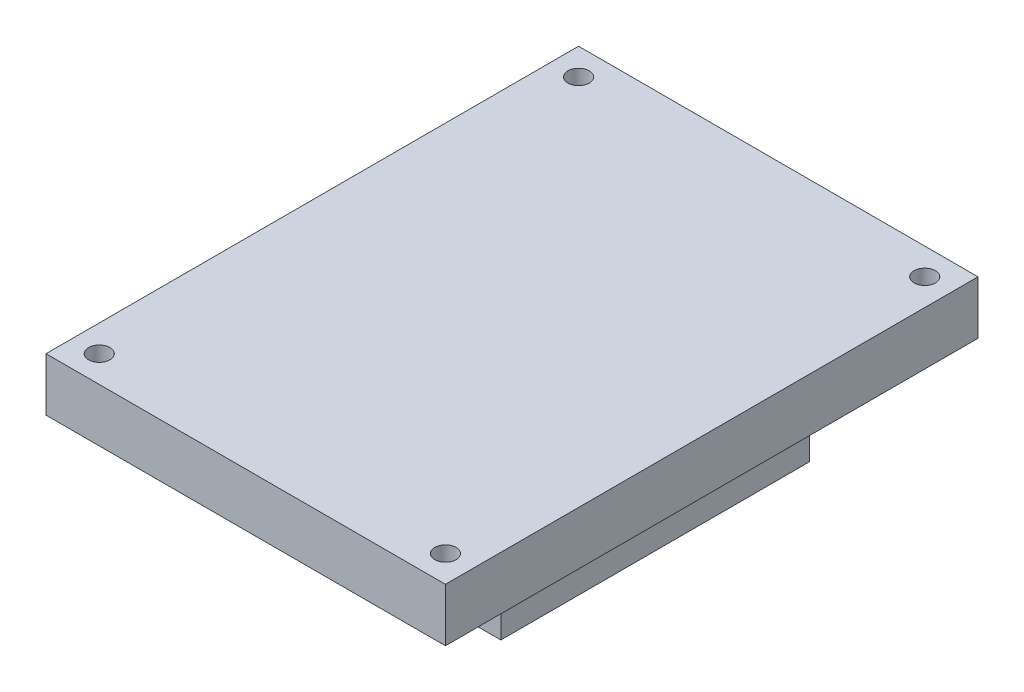
ISO-10303-21;
HEADER;
FILE_DESCRIPTION(('STEP AP214'),'2;1');
FILE_NAME('part.step','',(''),(''),'','','');
FILE_SCHEMA(('AUTOMOTIVE_DESIGN { 1 0 10303 214 1 1 1 1 }'));
ENDSEC;
DATA;
#1=APPLICATION_CONTEXT('core data for automotive mechanical design processes');
#2=APPLICATION_PROTOCOL_DEFINITION('international standard','automotive_design',2000,#1);
#3=PRODUCT_CONTEXT('',#1,'mechanical');
#4=PRODUCT('Part','Part','',(#3));
#5=PRODUCT_RELATED_PRODUCT_CATEGORY('part','',(#4));
#6=PRODUCT_DEFINITION_FORMATION('','',#4);
#7=PRODUCT_DEFINITION_CONTEXT('part definition',#1,'design');
#8=PRODUCT_DEFINITION('design','',#6,#7);
#9=PRODUCT_DEFINITION_SHAPE('','',#8);
#10=(LENGTH_UNIT() NAMED_UNIT(*) SI_UNIT(.MILLI.,.METRE.));
#11=(NAMED_UNIT(*) PLANE_ANGLE_UNIT() SI_UNIT($,.RADIAN.));
#12=(NAMED_UNIT(*) SI_UNIT($,.STERADIAN.) SOLID_ANGLE_UNIT());
#13=UNCERTAINTY_MEASURE_WITH_UNIT(LENGTH_MEASURE(1.E-05),#10,'distance_accuracy_value','');
#14=(GEOMETRIC_REPRESENTATION_CONTEXT(3) GLOBAL_UNCERTAINTY_ASSIGNED_CONTEXT((#13)) GLOBAL_UNIT_ASSIGNED_CONTEXT((#10,
#11,#12)) REPRESENTATION_CONTEXT('',''));
#15=CARTESIAN_POINT('',(0.,0.,0.));
#16=DIRECTION('',(0.,0.,1.));
#17=DIRECTION('',(1.,0.,0.));
#18=AXIS2_PLACEMENT_3D('',#15,#16,#17);
#19=CARTESIAN_POINT('',(0.,0.,0.));
#20=DIRECTION('',(0.,1.,0.));
#21=DIRECTION('',(0.,0.,1.));
#22=AXIS2_PLACEMENT_3D('',#19,#20,#21);
#23=PLANE('',#22);
#24=CARTESIAN_POINT('',(-32.5,0.,45.));
#25=DIRECTION('',(0.,-1.,0.));
#26=DIRECTION('',(0.,0.,1.));
#27=AXIS2_PLACEMENT_3D('',#24,#25,#26);
#28=CIRCLE('',#27,2.);
#29=CARTESIAN_POINT('',(-32.5,0.,47.));
#30=VERTEX_POINT('',#29);
#31=EDGE_CURVE('E556',#30,#30,#28,.T.);
#32=ORIENTED_EDGE('',*,*,#31,.F.);
#33=EDGE_LOOP('',(#32));
#34=FACE_BOUND('',#33,.T.);
#35=CARTESIAN_POINT('',(32.5,0.,45.));
#36=DIRECTION('',(0.,-1.,0.));
#37=DIRECTION('',(0.,0.,-1.));
#38=AXIS2_PLACEMENT_3D('',#35,#36,#37);
#39=CIRCLE('',#38,2.);
#40=CARTESIAN_POINT('',(32.5,0.,43.));
#41=VERTEX_POINT('',#40);
#42=EDGE_CURVE('E557',#41,#41,#39,.T.);
#43=ORIENTED_EDGE('',*,*,#42,.F.);
#44=EDGE_LOOP('',(#43));
#45=FACE_BOUND('',#44,.T.);
#46=CARTESIAN_POINT('',(32.5,0.,-45.));
#47=DIRECTION('',(0.,-1.,0.));
#48=DIRECTION('',(0.,0.,1.));
#49=AXIS2_PLACEMENT_3D('',#46,#47,#48);
#50=CIRCLE('',#49,2.);
#51=CARTESIAN_POINT('',(32.5,0.,-43.));
#52=VERTEX_POINT('',#51);
#53=EDGE_CURVE('E559',#52,#52,#50,.T.);
#54=ORIENTED_EDGE('',*,*,#53,.F.);
#55=EDGE_LOOP('',(#54));
#56=FACE_BOUND('',#55,.T.);
#57=CARTESIAN_POINT('',(-32.5,0.,-45.));
#58=DIRECTION('',(0.,-1.,0.));
#59=DIRECTION('',(0.,0.,-1.));
#60=AXIS2_PLACEMENT_3D('',#57,#58,#59);
#61=CIRCLE('',#60,2.);
#62=CARTESIAN_POINT('',(-32.5,0.,-47.));
#63=VERTEX_POINT('',#62);
#64=EDGE_CURVE('E230',#63,#63,#61,.T.);
#65=ORIENTED_EDGE('',*,*,#64,.F.);
#66=EDGE_LOOP('',(#65));
#67=FACE_BOUND('',#66,.T.);
#68=DIRECTION('',(0.,0.,1.));
#69=VECTOR('',#68,1.);
#70=CARTESIAN_POINT('',(-37.5,0.,50.));
#71=LINE('',#70,#69);
#72=CARTESIAN_POINT('',(-37.5,0.,-50.));
#73=VERTEX_POINT('',#72);
#74=CARTESIAN_POINT('',(-37.5,0.,50.));
#75=VERTEX_POINT('',#74);
#76=EDGE_CURVE('E200',#73,#75,#71,.T.);
#77=ORIENTED_EDGE('',*,*,#76,.F.);
#78=DIRECTION('',(-1.,0.,0.));
#79=VECTOR('',#78,1.);
#80=CARTESIAN_POINT('',(37.5,0.,-50.));
#81=LINE('',#80,#79);
#82=CARTESIAN_POINT('',(37.5,0.,-50.));
#83=VERTEX_POINT('',#82);
#84=EDGE_CURVE('E205',#83,#73,#81,.T.);
#85=ORIENTED_EDGE('',*,*,#84,.F.);
#86=DIRECTION('',(0.,0.,-1.));
#87=VECTOR('',#86,1.);
#88=CARTESIAN_POINT('',(37.5,0.,50.));
#89=LINE('',#88,#87);
#90=CARTESIAN_POINT('',(37.5,0.,50.));
#91=VERTEX_POINT('',#90);
#92=EDGE_CURVE('E216',#91,#83,#89,.T.);
#93=ORIENTED_EDGE('',*,*,#92,.F.);
#94=DIRECTION('',(1.,0.,0.));
#95=VECTOR('',#94,1.);
#96=CARTESIAN_POINT('',(37.5,0.,50.));
#97=LINE('',#96,#95);
#98=EDGE_CURVE('E214',#75,#91,#97,.T.);
#99=ORIENTED_EDGE('',*,*,#98,.F.);
#100=EDGE_LOOP('',(#77,#85,#93,#99));
#101=FACE_BOUND('',#100,.T.);
#102=DIRECTION('',(0.,0.,-1.));
#103=VECTOR('',#102,1.);
#104=CARTESIAN_POINT('',(-15.,0.,17.099834820955));
#105=LINE('',#104,#103);
#106=CARTESIAN_POINT('',(-15.,0.,17.099834820955));
#107=VERTEX_POINT('',#106);
#108=CARTESIAN_POINT('',(-15.,0.,-40.900165179045));
#109=VERTEX_POINT('',#108);
#110=EDGE_CURVE('E147',#107,#109,#105,.T.);
#111=ORIENTED_EDGE('',*,*,#110,.F.);
#112=DIRECTION('',(-1.,0.,0.));
#113=VECTOR('',#112,1.);
#114=CARTESIAN_POINT('',(-15.,0.,17.099834820955));
#115=LINE('',#114,#113);
#116=CARTESIAN_POINT('',(15.,0.,17.099834820955));
#117=VERTEX_POINT('',#116);
#118=EDGE_CURVE('E177',#117,#107,#115,.T.);
#119=ORIENTED_EDGE('',*,*,#118,.F.);
#120=DIRECTION('',(0.,0.,1.));
#121=VECTOR('',#120,1.);
#122=CARTESIAN_POINT('',(15.,0.,17.099834820955));
#123=LINE('',#122,#121);
#124=CARTESIAN_POINT('',(15.,0.,-40.900165179045));
#125=VERTEX_POINT('',#124);
#126=EDGE_CURVE('E61',#125,#117,#123,.T.);
#127=ORIENTED_EDGE('',*,*,#126,.F.);
#128=DIRECTION('',(1.,0.,0.));
#129=VECTOR('',#128,1.);
#130=CARTESIAN_POINT('',(-15.,0.,-40.900165179045));
#131=LINE('',#130,#129);
#132=EDGE_CURVE('E56',#109,#125,#131,.T.);
#133=ORIENTED_EDGE('',*,*,#132,.F.);
#134=EDGE_LOOP('',(#111,#119,#127,#133));
#135=FACE_BOUND('',#134,.T.);
#136=ADVANCED_FACE('F39',(#34,#45,#56,#67,#101,#135),#23,.F.);
#137=CARTESIAN_POINT('',(-37.5,10.,50.));
#138=DIRECTION('',(1.,0.,0.));
#139=DIRECTION('',(0.,0.,-1.));
#140=AXIS2_PLACEMENT_3D('',#137,#138,#139);
#141=PLANE('',#140);
#142=ORIENTED_EDGE('',*,*,#76,.T.);
#143=DIRECTION('',(0.,-1.,0.));
#144=VECTOR('',#143,1.);
#145=CARTESIAN_POINT('',(-37.5,10.,50.));
#146=LINE('',#145,#144);
#147=CARTESIAN_POINT('',(-37.5,10.,50.));
#148=VERTEX_POINT('',#147);
#149=EDGE_CURVE('E11',#148,#75,#146,.T.);
#150=ORIENTED_EDGE('',*,*,#149,.F.);
#151=DIRECTION('',(0.,0.,1.));
#152=VECTOR('',#151,1.);
#153=CARTESIAN_POINT('',(-37.5,10.,50.));
#154=LINE('',#153,#152);
#155=CARTESIAN_POINT('',(-37.5,10.,-50.));
#156=VERTEX_POINT('',#155);
#157=EDGE_CURVE('E201',#156,#148,#154,.T.);
#158=ORIENTED_EDGE('',*,*,#157,.F.);
#159=DIRECTION('',(0.,-1.,0.));
#160=VECTOR('',#159,1.);
#161=CARTESIAN_POINT('',(-37.5,10.,-50.));
#162=LINE('',#161,#160);
#163=EDGE_CURVE('E211',#156,#73,#162,.T.);
#164=ORIENTED_EDGE('',*,*,#163,.T.);
#165=EDGE_LOOP('',(#142,#150,#158,#164));
#166=FACE_BOUND('',#165,.T.);
#167=ADVANCED_FACE('F41',(#166),#141,.F.);
#168=CARTESIAN_POINT('',(37.5,10.,50.));
#169=DIRECTION('',(0.,0.,-1.));
#170=DIRECTION('',(-1.,0.,0.));
#171=AXIS2_PLACEMENT_3D('',#168,#169,#170);
#172=PLANE('',#171);
#173=ORIENTED_EDGE('',*,*,#98,.T.);
#174=DIRECTION('',(0.,-1.,0.));
#175=VECTOR('',#174,1.);
#176=CARTESIAN_POINT('',(37.5,10.,50.));
#177=LINE('',#176,#175);
#178=CARTESIAN_POINT('',(37.5,10.,50.));
#179=VERTEX_POINT('',#178);
#180=EDGE_CURVE('E48',#179,#91,#177,.T.);
#181=ORIENTED_EDGE('',*,*,#180,.F.);
#182=DIRECTION('',(1.,0.,0.));
#183=VECTOR('',#182,1.);
#184=CARTESIAN_POINT('',(37.5,10.,50.));
#185=LINE('',#184,#183);
#186=EDGE_CURVE('E204',#148,#179,#185,.T.);
#187=ORIENTED_EDGE('',*,*,#186,.F.);
#188=ORIENTED_EDGE('',*,*,#149,.T.);
#189=EDGE_LOOP('',(#173,#181,#187,#188));
#190=FACE_BOUND('',#189,.T.);
#191=ADVANCED_FACE('F311',(#190),#172,.F.);
#192=CARTESIAN_POINT('',(37.5,10.,50.));
#193=DIRECTION('',(-1.,0.,0.));
#194=DIRECTION('',(0.,0.,1.));
#195=AXIS2_PLACEMENT_3D('',#192,#193,#194);
#196=PLANE('',#195);
#197=ORIENTED_EDGE('',*,*,#92,.T.);
#198=DIRECTION('',(0.,-1.,0.));
#199=VECTOR('',#198,1.);
#200=CARTESIAN_POINT('',(37.5,10.,-50.));
#201=LINE('',#200,#199);
#202=CARTESIAN_POINT('',(37.5,10.,-50.));
#203=VERTEX_POINT('',#202);
#204=EDGE_CURVE('E221',#203,#83,#201,.T.);
#205=ORIENTED_EDGE('',*,*,#204,.F.);
#206=DIRECTION('',(0.,0.,-1.));
#207=VECTOR('',#206,1.);
#208=CARTESIAN_POINT('',(37.5,10.,50.));
#209=LINE('',#208,#207);
#210=EDGE_CURVE('E207',#179,#203,#209,.T.);
#211=ORIENTED_EDGE('',*,*,#210,.F.);
#212=ORIENTED_EDGE('',*,*,#180,.T.);
#213=EDGE_LOOP('',(#197,#205,#211,#212));
#214=FACE_BOUND('',#213,.T.);
#215=ADVANCED_FACE('F356',(#214),#196,.F.);
#216=CARTESIAN_POINT('',(37.5,10.,-50.));
#217=DIRECTION('',(0.,0.,1.));
#218=DIRECTION('',(1.,0.,0.));
#219=AXIS2_PLACEMENT_3D('',#216,#217,#218);
#220=PLANE('',#219);
#221=ORIENTED_EDGE('',*,*,#84,.T.);
#222=ORIENTED_EDGE('',*,*,#163,.F.);
#223=DIRECTION('',(-1.,0.,0.));
#224=VECTOR('',#223,1.);
#225=CARTESIAN_POINT('',(37.5,10.,-50.));
#226=LINE('',#225,#224);
#227=EDGE_CURVE('E209',#203,#156,#226,.T.);
#228=ORIENTED_EDGE('',*,*,#227,.F.);
#229=ORIENTED_EDGE('',*,*,#204,.T.);
#230=EDGE_LOOP('',(#221,#222,#228,#229));
#231=FACE_BOUND('',#230,.T.);
#232=ADVANCED_FACE('F350',(#231),#220,.F.);
#233=CARTESIAN_POINT('',(0.,10.,0.));
#234=DIRECTION('',(0.,1.,0.));
#235=DIRECTION('',(0.,0.,1.));
#236=AXIS2_PLACEMENT_3D('',#233,#234,#235);
#237=PLANE('',#236);
#238=CARTESIAN_POINT('',(-32.5,10.,45.));
#239=DIRECTION('',(0.,1.,0.));
#240=DIRECTION('',(0.,0.,1.));
#241=AXIS2_PLACEMENT_3D('',#238,#239,#240);
#242=CIRCLE('',#241,2.);
#243=CARTESIAN_POINT('',(-32.5,10.,47.));
#244=VERTEX_POINT('',#243);
#245=EDGE_CURVE('E43',#244,#244,#242,.T.);
#246=ORIENTED_EDGE('',*,*,#245,.F.);
#247=EDGE_LOOP('',(#246));
#248=FACE_BOUND('',#247,.T.);
#249=CARTESIAN_POINT('',(32.5,10.,45.));
#250=DIRECTION('',(0.,1.,0.));
#251=DIRECTION('',(0.,0.,1.));
#252=AXIS2_PLACEMENT_3D('',#249,#250,#251);
#253=CIRCLE('',#252,2.);
#254=CARTESIAN_POINT('',(32.5,10.,47.));
#255=VERTEX_POINT('',#254);
#256=EDGE_CURVE('E232',#255,#255,#253,.T.);
#257=ORIENTED_EDGE('',*,*,#256,.F.);
#258=EDGE_LOOP('',(#257));
#259=FACE_BOUND('',#258,.T.);
#260=CARTESIAN_POINT('',(32.5,10.,-45.));
#261=DIRECTION('',(0.,1.,0.));
#262=DIRECTION('',(0.,0.,1.));
#263=AXIS2_PLACEMENT_3D('',#260,#261,#262);
#264=CIRCLE('',#263,2.);
#265=CARTESIAN_POINT('',(32.5,10.,-43.));
#266=VERTEX_POINT('',#265);
#267=EDGE_CURVE('E229',#266,#266,#264,.T.);
#268=ORIENTED_EDGE('',*,*,#267,.F.);
#269=EDGE_LOOP('',(#268));
#270=FACE_BOUND('',#269,.T.);
#271=CARTESIAN_POINT('',(-32.5,10.,-45.));
#272=DIRECTION('',(0.,1.,0.));
#273=DIRECTION('',(0.,0.,1.));
#274=AXIS2_PLACEMENT_3D('',#271,#272,#273);
#275=CIRCLE('',#274,2.);
#276=CARTESIAN_POINT('',(-32.5,10.,-43.));
#277=VERTEX_POINT('',#276);
#278=EDGE_CURVE('E226',#277,#277,#275,.T.);
#279=ORIENTED_EDGE('',*,*,#278,.F.);
#280=EDGE_LOOP('',(#279));
#281=FACE_BOUND('',#280,.T.);
#282=ORIENTED_EDGE('',*,*,#157,.T.);
#283=ORIENTED_EDGE('',*,*,#186,.T.);
#284=ORIENTED_EDGE('',*,*,#210,.T.);
#285=ORIENTED_EDGE('',*,*,#227,.T.);
#286=EDGE_LOOP('',(#282,#283,#284,#285));
#287=FACE_BOUND('',#286,.T.);
#288=ADVANCED_FACE('F283',(#248,#259,#270,#281,#287),#237,.T.);
#289=CARTESIAN_POINT('',(0.,-26.76,0.));
#290=DIRECTION('',(0.,-1.,0.));
#291=DIRECTION('',(0.,0.,-1.));
#292=AXIS2_PLACEMENT_3D('',#289,#290,#291);
#293=PLANE('',#292);
#294=CARTESIAN_POINT('',(-4.99999999999998,-26.76,-36.200165179045));
#295=DIRECTION('',(0.,-1.,0.));
#296=DIRECTION('',(0.,0.,-1.));
#297=AXIS2_PLACEMENT_3D('',#294,#295,#296);
#298=CIRCLE('',#297,2.);
#299=CARTESIAN_POINT('',(-4.99999999999998,-26.76,-38.200165179045));
#300=VERTEX_POINT('',#299);
#301=EDGE_CURVE('E241',#300,#300,#298,.T.);
#302=ORIENTED_EDGE('',*,*,#301,.F.);
#303=EDGE_LOOP('',(#302));
#304=FACE_BOUND('',#303,.T.);
#305=CARTESIAN_POINT('',(5.00000000000002,-26.76,-36.200165179045));
#306=DIRECTION('',(0.,-1.,0.));
#307=DIRECTION('',(0.,0.,-1.));
#308=AXIS2_PLACEMENT_3D('',#305,#306,#307);
#309=CIRCLE('',#308,2.);
#310=CARTESIAN_POINT('',(5.00000000000002,-26.76,-38.200165179045));
#311=VERTEX_POINT('',#310);
#312=EDGE_CURVE('E262',#311,#311,#309,.T.);
#313=ORIENTED_EDGE('',*,*,#312,.F.);
#314=EDGE_LOOP('',(#313));
#315=FACE_BOUND('',#314,.T.);
#316=CARTESIAN_POINT('',(5.00000000000001,-26.76,12.399834820955));
#317=DIRECTION('',(0.,-1.,0.));
#318=DIRECTION('',(0.,0.,-1.));
#319=AXIS2_PLACEMENT_3D('',#316,#317,#318);
#320=CIRCLE('',#319,2.);
#321=CARTESIAN_POINT('',(5.00000000000001,-26.76,10.399834820955));
#322=VERTEX_POINT('',#321);
#323=EDGE_CURVE('E253',#322,#322,#320,.T.);
#324=ORIENTED_EDGE('',*,*,#323,.F.);
#325=EDGE_LOOP('',(#324));
#326=FACE_BOUND('',#325,.T.);
#327=CARTESIAN_POINT('',(-4.99999999999999,-26.76,12.399834820955));
#328=DIRECTION('',(0.,-1.,0.));
#329=DIRECTION('',(0.,0.,-1.));
#330=AXIS2_PLACEMENT_3D('',#327,#328,#329);
#331=CIRCLE('',#330,2.);
#332=CARTESIAN_POINT('',(-4.99999999999999,-26.76,10.399834820955));
#333=VERTEX_POINT('',#332);
#334=EDGE_CURVE('E251',#333,#333,#331,.T.);
#335=ORIENTED_EDGE('',*,*,#334,.F.);
#336=EDGE_LOOP('',(#335));
#337=FACE_BOUND('',#336,.T.);
#338=DIRECTION('',(0.,0.,-1.));
#339=VECTOR('',#338,1.);
#340=CARTESIAN_POINT('',(-15.,-26.76,17.099834820955));
#341=LINE('',#340,#339);
#342=CARTESIAN_POINT('',(-15.,-26.76,17.099834820955));
#343=VERTEX_POINT('',#342);
#344=CARTESIAN_POINT('',(-15.,-26.76,-40.900165179045));
#345=VERTEX_POINT('',#344);
#346=EDGE_CURVE('E173',#343,#345,#341,.T.);
#347=ORIENTED_EDGE('',*,*,#346,.T.);
#348=DIRECTION('',(1.,0.,0.));
#349=VECTOR('',#348,1.);
#350=CARTESIAN_POINT('',(-15.,-26.76,-40.900165179045));
#351=LINE('',#350,#349);
#352=CARTESIAN_POINT('',(15.,-26.76,-40.900165179045));
#353=VERTEX_POINT('',#352);
#354=EDGE_CURVE('E176',#345,#353,#351,.T.);
#355=ORIENTED_EDGE('',*,*,#354,.T.);
#356=DIRECTION('',(0.,0.,1.));
#357=VECTOR('',#356,1.);
#358=CARTESIAN_POINT('',(15.,-26.76,17.099834820955));
#359=LINE('',#358,#357);
#360=CARTESIAN_POINT('',(15.,-26.76,17.099834820955));
#361=VERTEX_POINT('',#360);
#362=EDGE_CURVE('E179',#353,#361,#359,.T.);
#363=ORIENTED_EDGE('',*,*,#362,.T.);
#364=DIRECTION('',(-1.,0.,0.));
#365=VECTOR('',#364,1.);
#366=CARTESIAN_POINT('',(-15.,-26.76,17.099834820955));
#367=LINE('',#366,#365);
#368=EDGE_CURVE('E181',#361,#343,#367,.T.);
#369=ORIENTED_EDGE('',*,*,#368,.T.);
#370=EDGE_LOOP('',(#347,#355,#363,#369));
#371=FACE_BOUND('',#370,.T.);
#372=DIRECTION('',(1.,0.,0.));
#373=VECTOR('',#372,1.);
#374=CARTESIAN_POINT('',(-9.99999999999998,-26.76,-32.350165179045));
#375=LINE('',#374,#373);
#376=CARTESIAN_POINT('',(-9.99999999999998,-26.76,-32.350165179045));
#377=VERTEX_POINT('',#376);
#378=CARTESIAN_POINT('',(10.,-26.76,-32.350165179045));
#379=VERTEX_POINT('',#378);
#380=EDGE_CURVE('E139',#377,#379,#375,.T.);
#381=ORIENTED_EDGE('',*,*,#380,.F.);
#382=DIRECTION('',(0.,0.,-1.));
#383=VECTOR('',#382,1.);
#384=CARTESIAN_POINT('',(-9.99999999999998,-26.76,8.549834820955));
#385=LINE('',#384,#383);
#386=CARTESIAN_POINT('',(-9.99999999999998,-26.76,8.549834820955));
#387=VERTEX_POINT('',#386);
#388=EDGE_CURVE('E129',#387,#377,#385,.T.);
#389=ORIENTED_EDGE('',*,*,#388,.F.);
#390=DIRECTION('',(-1.,0.,0.));
#391=VECTOR('',#390,1.);
#392=CARTESIAN_POINT('',(-9.99999999999998,-26.76,8.549834820955));
#393=LINE('',#392,#391);
#394=CARTESIAN_POINT('',(10.,-26.76,8.549834820955));
#395=VERTEX_POINT('',#394);
#396=EDGE_CURVE('E155',#395,#387,#393,.T.);
#397=ORIENTED_EDGE('',*,*,#396,.F.);
#398=DIRECTION('',(0.,0.,1.));
#399=VECTOR('',#398,1.);
#400=CARTESIAN_POINT('',(10.,-26.76,8.549834820955));
#401=LINE('',#400,#399);
#402=EDGE_CURVE('E153',#379,#395,#401,.T.);
#403=ORIENTED_EDGE('',*,*,#402,.F.);
#404=EDGE_LOOP('',(#381,#389,#397,#403));
#405=FACE_BOUND('',#404,.T.);
#406=ADVANCED_FACE('F151',(#304,#315,#326,#337,#371,#405),#293,.T.);
#407=CARTESIAN_POINT('',(-15.,-26.76,17.099834820955));
#408=DIRECTION('',(1.,0.,0.));
#409=DIRECTION('',(0.,0.,-1.));
#410=AXIS2_PLACEMENT_3D('',#407,#408,#409);
#411=PLANE('',#410);
#412=ORIENTED_EDGE('',*,*,#110,.T.);
#413=DIRECTION('',(0.,1.,0.));
#414=VECTOR('',#413,1.);
#415=CARTESIAN_POINT('',(-15.,-26.76,-40.900165179045));
#416=LINE('',#415,#414);
#417=EDGE_CURVE('E198',#345,#109,#416,.T.);
#418=ORIENTED_EDGE('',*,*,#417,.F.);
#419=ORIENTED_EDGE('',*,*,#346,.F.);
#420=DIRECTION('',(0.,1.,0.));
#421=VECTOR('',#420,1.);
#422=CARTESIAN_POINT('',(-15.,-26.76,17.099834820955));
#423=LINE('',#422,#421);
#424=EDGE_CURVE('E183',#343,#107,#423,.T.);
#425=ORIENTED_EDGE('',*,*,#424,.T.);
#426=EDGE_LOOP('',(#412,#418,#419,#425));
#427=FACE_BOUND('',#426,.T.);
#428=ADVANCED_FACE('F282',(#427),#411,.F.);
#429=CARTESIAN_POINT('',(-15.,-26.76,-40.900165179045));
#430=DIRECTION('',(0.,0.,1.));
#431=DIRECTION('',(1.,0.,0.));
#432=AXIS2_PLACEMENT_3D('',#429,#430,#431);
#433=PLANE('',#432);
#434=ORIENTED_EDGE('',*,*,#132,.T.);
#435=DIRECTION('',(0.,1.,0.));
#436=VECTOR('',#435,1.);
#437=CARTESIAN_POINT('',(15.,-26.76,-40.900165179045));
#438=LINE('',#437,#436);
#439=EDGE_CURVE('E195',#353,#125,#438,.T.);
#440=ORIENTED_EDGE('',*,*,#439,.F.);
#441=ORIENTED_EDGE('',*,*,#354,.F.);
#442=ORIENTED_EDGE('',*,*,#417,.T.);
#443=EDGE_LOOP('',(#434,#440,#441,#442));
#444=FACE_BOUND('',#443,.T.);
#445=ADVANCED_FACE('F295',(#444),#433,.F.);
#446=CARTESIAN_POINT('',(15.,-26.76,17.099834820955));
#447=DIRECTION('',(-1.,0.,0.));
#448=DIRECTION('',(0.,0.,1.));
#449=AXIS2_PLACEMENT_3D('',#446,#447,#448);
#450=PLANE('',#449);
#451=ORIENTED_EDGE('',*,*,#126,.T.);
#452=DIRECTION('',(0.,1.,0.));
#453=VECTOR('',#452,1.);
#454=CARTESIAN_POINT('',(15.,-26.76,17.099834820955));
#455=LINE('',#454,#453);
#456=EDGE_CURVE('E192',#361,#117,#455,.T.);
#457=ORIENTED_EDGE('',*,*,#456,.F.);
#458=ORIENTED_EDGE('',*,*,#362,.F.);
#459=ORIENTED_EDGE('',*,*,#439,.T.);
#460=EDGE_LOOP('',(#451,#457,#458,#459));
#461=FACE_BOUND('',#460,.T.);
#462=ADVANCED_FACE('F299',(#461),#450,.F.);
#463=CARTESIAN_POINT('',(-15.,-26.76,17.099834820955));
#464=DIRECTION('',(0.,0.,-1.));
#465=DIRECTION('',(-1.,0.,0.));
#466=AXIS2_PLACEMENT_3D('',#463,#464,#465);
#467=PLANE('',#466);
#468=ORIENTED_EDGE('',*,*,#118,.T.);
#469=ORIENTED_EDGE('',*,*,#424,.F.);
#470=ORIENTED_EDGE('',*,*,#368,.F.);
#471=ORIENTED_EDGE('',*,*,#456,.T.);
#472=EDGE_LOOP('',(#468,#469,#470,#471));
#473=FACE_BOUND('',#472,.T.);
#474=ADVANCED_FACE('F301',(#473),#467,.F.);
#475=CARTESIAN_POINT('',(-9.99999999999998,-26.76,8.549834820955));
#476=DIRECTION('',(1.,0.,0.));
#477=DIRECTION('',(0.,0.,-1.));
#478=AXIS2_PLACEMENT_3D('',#475,#476,#477);
#479=PLANE('',#478);
#480=DIRECTION('',(0.,0.,-1.));
#481=VECTOR('',#480,1.);
#482=CARTESIAN_POINT('',(-9.99999999999998,0.,8.549834820955));
#483=LINE('',#482,#481);
#484=CARTESIAN_POINT('',(-9.99999999999998,0.,8.549834820955));
#485=VERTEX_POINT('',#484);
#486=CARTESIAN_POINT('',(-9.99999999999998,0.,-32.350165179045));
#487=VERTEX_POINT('',#486);
#488=EDGE_CURVE('E160',#485,#487,#483,.T.);
#489=ORIENTED_EDGE('',*,*,#488,.F.);
#490=DIRECTION('',(0.,1.,0.));
#491=VECTOR('',#490,1.);
#492=CARTESIAN_POINT('',(-9.99999999999998,-26.76,8.549834820955));
#493=LINE('',#492,#491);
#494=EDGE_CURVE('E135',#387,#485,#493,.T.);
#495=ORIENTED_EDGE('',*,*,#494,.F.);
#496=ORIENTED_EDGE('',*,*,#388,.T.);
#497=DIRECTION('',(0.,1.,0.));
#498=VECTOR('',#497,1.);
#499=CARTESIAN_POINT('',(-9.99999999999998,-26.76,-32.350165179045));
#500=LINE('',#499,#498);
#501=EDGE_CURVE('E133',#377,#487,#500,.T.);
#502=ORIENTED_EDGE('',*,*,#501,.T.);
#503=EDGE_LOOP('',(#489,#495,#496,#502));
#504=FACE_BOUND('',#503,.T.);
#505=ADVANCED_FACE('F132',(#504),#479,.T.);
#506=CARTESIAN_POINT('',(-9.99999999999998,-26.76,-32.350165179045));
#507=DIRECTION('',(0.,0.,1.));
#508=DIRECTION('',(1.,0.,0.));
#509=AXIS2_PLACEMENT_3D('',#506,#507,#508);
#510=PLANE('',#509);
#511=DIRECTION('',(1.,0.,0.));
#512=VECTOR('',#511,1.);
#513=CARTESIAN_POINT('',(-9.99999999999998,0.,-32.350165179045));
#514=LINE('',#513,#512);
#515=CARTESIAN_POINT('',(10.,0.,-32.350165179045));
#516=VERTEX_POINT('',#515);
#517=EDGE_CURVE('E146',#487,#516,#514,.T.);
#518=ORIENTED_EDGE('',*,*,#517,.F.);
#519=ORIENTED_EDGE('',*,*,#501,.F.);
#520=ORIENTED_EDGE('',*,*,#380,.T.);
#521=DIRECTION('',(0.,1.,0.));
#522=VECTOR('',#521,1.);
#523=CARTESIAN_POINT('',(10.,-26.76,-32.350165179045));
#524=LINE('',#523,#522);
#525=EDGE_CURVE('E148',#379,#516,#524,.T.);
#526=ORIENTED_EDGE('',*,*,#525,.T.);
#527=EDGE_LOOP('',(#518,#519,#520,#526));
#528=FACE_BOUND('',#527,.T.);
#529=ADVANCED_FACE('F143',(#528),#510,.T.);
#530=CARTESIAN_POINT('',(10.,-26.76,8.549834820955));
#531=DIRECTION('',(-1.,0.,0.));
#532=DIRECTION('',(0.,0.,1.));
#533=AXIS2_PLACEMENT_3D('',#530,#531,#532);
#534=PLANE('',#533);
#535=DIRECTION('',(0.,0.,1.));
#536=VECTOR('',#535,1.);
#537=CARTESIAN_POINT('',(10.,0.,8.549834820955));
#538=LINE('',#537,#536);
#539=CARTESIAN_POINT('',(10.,0.,8.549834820955));
#540=VERTEX_POINT('',#539);
#541=EDGE_CURVE('E164',#516,#540,#538,.T.);
#542=ORIENTED_EDGE('',*,*,#541,.F.);
#543=ORIENTED_EDGE('',*,*,#525,.F.);
#544=ORIENTED_EDGE('',*,*,#402,.T.);
#545=DIRECTION('',(0.,1.,0.));
#546=VECTOR('',#545,1.);
#547=CARTESIAN_POINT('',(10.,-26.76,8.549834820955));
#548=LINE('',#547,#546);
#549=EDGE_CURVE('E170',#395,#540,#548,.T.);
#550=ORIENTED_EDGE('',*,*,#549,.T.);
#551=EDGE_LOOP('',(#542,#543,#544,#550));
#552=FACE_BOUND('',#551,.T.);
#553=ADVANCED_FACE('F328',(#552),#534,.T.);
#554=CARTESIAN_POINT('',(-9.99999999999998,-26.76,8.549834820955));
#555=DIRECTION('',(0.,0.,-1.));
#556=DIRECTION('',(-1.,0.,0.));
#557=AXIS2_PLACEMENT_3D('',#554,#555,#556);
#558=PLANE('',#557);
#559=DIRECTION('',(-1.,0.,0.));
#560=VECTOR('',#559,1.);
#561=CARTESIAN_POINT('',(-9.99999999999998,0.,8.549834820955));
#562=LINE('',#561,#560);
#563=EDGE_CURVE('E140',#540,#485,#562,.T.);
#564=ORIENTED_EDGE('',*,*,#563,.F.);
#565=ORIENTED_EDGE('',*,*,#549,.F.);
#566=ORIENTED_EDGE('',*,*,#396,.T.);
#567=ORIENTED_EDGE('',*,*,#494,.T.);
#568=EDGE_LOOP('',(#564,#565,#566,#567));
#569=FACE_BOUND('',#568,.T.);
#570=ADVANCED_FACE('F319',(#569),#558,.T.);
#571=ORIENTED_EDGE('',*,*,#563,.T.);
#572=ORIENTED_EDGE('',*,*,#488,.T.);
#573=ORIENTED_EDGE('',*,*,#517,.T.);
#574=ORIENTED_EDGE('',*,*,#541,.T.);
#575=EDGE_LOOP('',(#571,#572,#573,#574));
#576=FACE_BOUND('',#575,.T.);
#577=ADVANCED_FACE('F305',(#576),#23,.F.);
#578=CARTESIAN_POINT('',(-4.99999999999999,-23.76,12.399834820955));
#579=DIRECTION('',(0.,-1.,0.));
#580=DIRECTION('',(0.,0.,-1.));
#581=AXIS2_PLACEMENT_3D('',#578,#579,#580);
#582=CYLINDRICAL_SURFACE('',#581,2.);
#583=CARTESIAN_POINT('',(-4.99999999999999,-23.76,12.399834820955));
#584=DIRECTION('',(0.,-1.,0.));
#585=DIRECTION('',(0.,0.,-1.));
#586=AXIS2_PLACEMENT_3D('',#583,#584,#585);
#587=CIRCLE('',#586,2.);
#588=CARTESIAN_POINT('',(-4.99999999999999,-23.76,10.399834820955));
#589=VERTEX_POINT('',#588);
#590=EDGE_CURVE('E162',#589,#589,#587,.T.);
#591=ORIENTED_EDGE('',*,*,#590,.F.);
#592=EDGE_LOOP('',(#591));
#593=FACE_BOUND('',#592,.T.);
#594=ORIENTED_EDGE('',*,*,#334,.T.);
#595=EDGE_LOOP('',(#594));
#596=FACE_BOUND('',#595,.T.);
#597=ADVANCED_FACE('F318',(#593,#596),#582,.F.);
#598=CARTESIAN_POINT('',(-4.99999999999999,-23.76,12.399834820955));
#599=DIRECTION('',(0.,-1.,0.));
#600=DIRECTION('',(0.,0.,-1.));
#601=AXIS2_PLACEMENT_3D('',#598,#599,#600);
#602=PLANE('',#601);
#603=ORIENTED_EDGE('',*,*,#590,.T.);
#604=EDGE_LOOP('',(#603));
#605=FACE_BOUND('',#604,.T.);
#606=ADVANCED_FACE('F325',(#605),#602,.T.);
#607=CARTESIAN_POINT('',(5.00000000000001,-23.76,12.399834820955));
#608=DIRECTION('',(0.,-1.,0.));
#609=DIRECTION('',(0.,0.,-1.));
#610=AXIS2_PLACEMENT_3D('',#607,#608,#609);
#611=CYLINDRICAL_SURFACE('',#610,2.);
#612=CARTESIAN_POINT('',(5.00000000000001,-23.76,12.399834820955));
#613=DIRECTION('',(0.,-1.,0.));
#614=DIRECTION('',(0.,0.,-1.));
#615=AXIS2_PLACEMENT_3D('',#612,#613,#614);
#616=CIRCLE('',#615,2.);
#617=CARTESIAN_POINT('',(5.00000000000001,-23.76,10.399834820955));
#618=VERTEX_POINT('',#617);
#619=EDGE_CURVE('E257',#618,#618,#616,.T.);
#620=ORIENTED_EDGE('',*,*,#619,.F.);
#621=EDGE_LOOP('',(#620));
#622=FACE_BOUND('',#621,.T.);
#623=ORIENTED_EDGE('',*,*,#323,.T.);
#624=EDGE_LOOP('',(#623));
#625=FACE_BOUND('',#624,.T.);
#626=ADVANCED_FACE('F469',(#622,#625),#611,.F.);
#627=CARTESIAN_POINT('',(5.00000000000001,-23.76,12.399834820955));
#628=DIRECTION('',(0.,-1.,0.));
#629=DIRECTION('',(0.,0.,-1.));
#630=AXIS2_PLACEMENT_3D('',#627,#628,#629);
#631=PLANE('',#630);
#632=ORIENTED_EDGE('',*,*,#619,.T.);
#633=EDGE_LOOP('',(#632));
#634=FACE_BOUND('',#633,.T.);
#635=ADVANCED_FACE('F276',(#634),#631,.T.);
#636=CARTESIAN_POINT('',(5.00000000000002,-23.76,-36.200165179045));
#637=DIRECTION('',(0.,-1.,0.));
#638=DIRECTION('',(0.,0.,-1.));
#639=AXIS2_PLACEMENT_3D('',#636,#637,#638);
#640=CYLINDRICAL_SURFACE('',#639,2.);
#641=CARTESIAN_POINT('',(5.00000000000002,-23.76,-36.200165179045));
#642=DIRECTION('',(0.,-1.,0.));
#643=DIRECTION('',(0.,0.,-1.));
#644=AXIS2_PLACEMENT_3D('',#641,#642,#643);
#645=CIRCLE('',#644,2.);
#646=CARTESIAN_POINT('',(5.00000000000002,-23.76,-38.200165179045));
#647=VERTEX_POINT('',#646);
#648=EDGE_CURVE('E246',#647,#647,#645,.T.);
#649=ORIENTED_EDGE('',*,*,#648,.F.);
#650=EDGE_LOOP('',(#649));
#651=FACE_BOUND('',#650,.T.);
#652=ORIENTED_EDGE('',*,*,#312,.T.);
#653=EDGE_LOOP('',(#652));
#654=FACE_BOUND('',#653,.T.);
#655=ADVANCED_FACE('F273',(#651,#654),#640,.F.);
#656=CARTESIAN_POINT('',(5.00000000000002,-23.76,-36.200165179045));
#657=DIRECTION('',(0.,-1.,0.));
#658=DIRECTION('',(0.,0.,-1.));
#659=AXIS2_PLACEMENT_3D('',#656,#657,#658);
#660=PLANE('',#659);
#661=ORIENTED_EDGE('',*,*,#648,.T.);
#662=EDGE_LOOP('',(#661));
#663=FACE_BOUND('',#662,.T.);
#664=ADVANCED_FACE('F271',(#663),#660,.T.);
#665=CARTESIAN_POINT('',(-4.99999999999998,-23.76,-36.200165179045));
#666=DIRECTION('',(0.,-1.,0.));
#667=DIRECTION('',(0.,0.,-1.));
#668=AXIS2_PLACEMENT_3D('',#665,#666,#667);
#669=CYLINDRICAL_SURFACE('',#668,2.);
#670=CARTESIAN_POINT('',(-4.99999999999998,-23.76,-36.200165179045));
#671=DIRECTION('',(0.,-1.,0.));
#672=DIRECTION('',(0.,0.,-1.));
#673=AXIS2_PLACEMENT_3D('',#670,#671,#672);
#674=CIRCLE('',#673,2.);
#675=CARTESIAN_POINT('',(-4.99999999999998,-23.76,-38.200165179045));
#676=VERTEX_POINT('',#675);
#677=EDGE_CURVE('E237',#676,#676,#674,.T.);
#678=ORIENTED_EDGE('',*,*,#677,.F.);
#679=EDGE_LOOP('',(#678));
#680=FACE_BOUND('',#679,.T.);
#681=ORIENTED_EDGE('',*,*,#301,.T.);
#682=EDGE_LOOP('',(#681));
#683=FACE_BOUND('',#682,.T.);
#684=ADVANCED_FACE('F499',(#680,#683),#669,.F.);
#685=CARTESIAN_POINT('',(-4.99999999999998,-23.76,-36.200165179045));
#686=DIRECTION('',(0.,-1.,0.));
#687=DIRECTION('',(0.,0.,-1.));
#688=AXIS2_PLACEMENT_3D('',#685,#686,#687);
#689=PLANE('',#688);
#690=ORIENTED_EDGE('',*,*,#677,.T.);
#691=EDGE_LOOP('',(#690));
#692=FACE_BOUND('',#691,.T.);
#693=ADVANCED_FACE('F507',(#692),#689,.T.);
#694=CARTESIAN_POINT('',(-32.5,23.,-45.));
#695=DIRECTION('',(0.,-1.,0.));
#696=DIRECTION('',(0.,0.,-1.));
#697=AXIS2_PLACEMENT_3D('',#694,#695,#696);
#698=CYLINDRICAL_SURFACE('',#697,2.);
#699=ORIENTED_EDGE('',*,*,#278,.T.);
#700=EDGE_LOOP('',(#699));
#701=FACE_BOUND('',#700,.T.);
#702=ORIENTED_EDGE('',*,*,#64,.T.);
#703=EDGE_LOOP('',(#702));
#704=FACE_BOUND('',#703,.T.);
#705=ADVANCED_FACE('F515',(#701,#704),#698,.F.);
#706=CARTESIAN_POINT('',(32.5,23.,-45.));
#707=DIRECTION('',(0.,-1.,0.));
#708=DIRECTION('',(0.,0.,-1.));
#709=AXIS2_PLACEMENT_3D('',#706,#707,#708);
#710=CYLINDRICAL_SURFACE('',#709,2.);
#711=ORIENTED_EDGE('',*,*,#267,.T.);
#712=EDGE_LOOP('',(#711));
#713=FACE_BOUND('',#712,.T.);
#714=ORIENTED_EDGE('',*,*,#53,.T.);
#715=EDGE_LOOP('',(#714));
#716=FACE_BOUND('',#715,.T.);
#717=ADVANCED_FACE('F522',(#713,#716),#710,.F.);
#718=CARTESIAN_POINT('',(32.5,23.,45.));
#719=DIRECTION('',(0.,-1.,0.));
#720=DIRECTION('',(0.,0.,-1.));
#721=AXIS2_PLACEMENT_3D('',#718,#719,#720);
#722=CYLINDRICAL_SURFACE('',#721,2.);
#723=ORIENTED_EDGE('',*,*,#256,.T.);
#724=EDGE_LOOP('',(#723));
#725=FACE_BOUND('',#724,.T.);
#726=ORIENTED_EDGE('',*,*,#42,.T.);
#727=EDGE_LOOP('',(#726));
#728=FACE_BOUND('',#727,.T.);
#729=ADVANCED_FACE('F531',(#725,#728),#722,.F.);
#730=CARTESIAN_POINT('',(-32.5,23.,45.));
#731=DIRECTION('',(0.,-1.,0.));
#732=DIRECTION('',(0.,0.,-1.));
#733=AXIS2_PLACEMENT_3D('',#730,#731,#732);
#734=CYLINDRICAL_SURFACE('',#733,2.);
#735=ORIENTED_EDGE('',*,*,#245,.T.);
#736=EDGE_LOOP('',(#735));
#737=FACE_BOUND('',#736,.T.);
#738=ORIENTED_EDGE('',*,*,#31,.T.);
#739=EDGE_LOOP('',(#738));
#740=FACE_BOUND('',#739,.T.);
#741=ADVANCED_FACE('F540',(#737,#740),#734,.F.);
#742=CLOSED_SHELL('',(#136,#167,#191,#215,#232,#288,#406,#428,#445,#462,#474,#505,#529,#553,
#570,#577,#597,#606,#626,#635,#655,#664,#684,#693,#705,#717,#729,#741));
#743=MANIFOLD_SOLID_BREP('B2',#742);
#744=ADVANCED_BREP_SHAPE_REPRESENTATION('',(#18,#743),#14);
#745=SHAPE_DEFINITION_REPRESENTATION(#9,#744);
ENDSEC;
END-ISO-10303-21;
